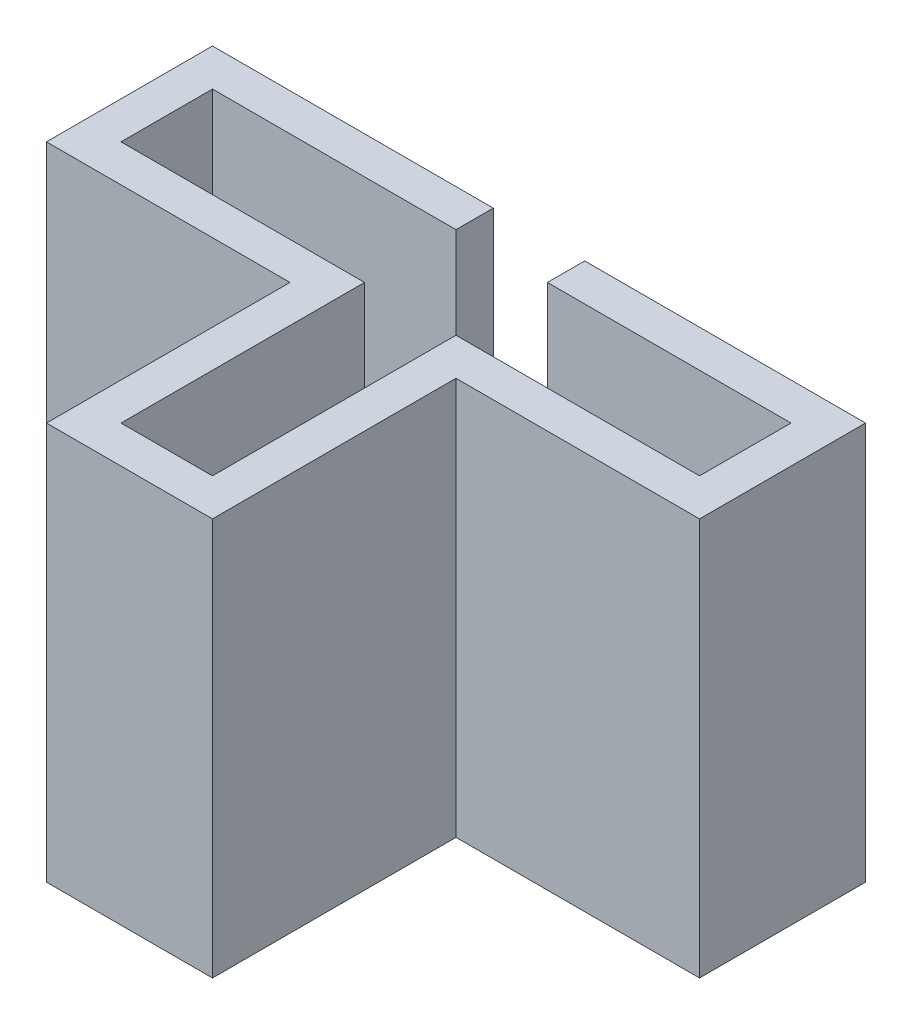
ISO-10303-21;
HEADER;
FILE_DESCRIPTION(('STEP AP214'),'2;1');
FILE_NAME('part.step','',(''),(''),'','','');
FILE_SCHEMA(('AUTOMOTIVE_DESIGN { 1 0 10303 214 1 1 1 1 }'));
ENDSEC;
DATA;
#1=APPLICATION_CONTEXT('core data for automotive mechanical design processes');
#2=APPLICATION_PROTOCOL_DEFINITION('international standard','automotive_design',2000,#1);
#3=PRODUCT_CONTEXT('',#1,'mechanical');
#4=PRODUCT('Part','Part','',(#3));
#5=PRODUCT_RELATED_PRODUCT_CATEGORY('part','',(#4));
#6=PRODUCT_DEFINITION_FORMATION('','',#4);
#7=PRODUCT_DEFINITION_CONTEXT('part definition',#1,'design');
#8=PRODUCT_DEFINITION('design','',#6,#7);
#9=PRODUCT_DEFINITION_SHAPE('','',#8);
#10=(LENGTH_UNIT() NAMED_UNIT(*) SI_UNIT(.MILLI.,.METRE.));
#11=(NAMED_UNIT(*) PLANE_ANGLE_UNIT() SI_UNIT($,.RADIAN.));
#12=(NAMED_UNIT(*) SI_UNIT($,.STERADIAN.) SOLID_ANGLE_UNIT());
#13=UNCERTAINTY_MEASURE_WITH_UNIT(LENGTH_MEASURE(1.E-05),#10,'distance_accuracy_value','');
#14=(GEOMETRIC_REPRESENTATION_CONTEXT(3) GLOBAL_UNCERTAINTY_ASSIGNED_CONTEXT((#13)) GLOBAL_UNIT_ASSIGNED_CONTEXT((#10,
#11,#12)) REPRESENTATION_CONTEXT('',''));
#15=CARTESIAN_POINT('',(0.,0.,0.));
#16=DIRECTION('',(0.,0.,1.));
#17=DIRECTION('',(1.,0.,0.));
#18=AXIS2_PLACEMENT_3D('',#15,#16,#17);
#19=CARTESIAN_POINT('',(-5.84200000000001,50.8,0.));
#20=DIRECTION('',(1.,0.,0.));
#21=DIRECTION('',(0.,0.,-1.));
#22=AXIS2_PLACEMENT_3D('',#19,#20,#21);
#23=PLANE('',#22);
#24=DIRECTION('',(0.,0.,1.));
#25=VECTOR('',#24,1.);
#26=CARTESIAN_POINT('',(-5.84200000000001,0.,0.));
#27=LINE('',#26,#25);
#28=CARTESIAN_POINT('',(-5.84200000000001,0.,-10.6045));
#29=VERTEX_POINT('',#28);
#30=CARTESIAN_POINT('',(-5.84200000000001,0.,-5.842));
#31=VERTEX_POINT('',#30);
#32=EDGE_CURVE('E262',#29,#31,#27,.T.);
#33=ORIENTED_EDGE('',*,*,#32,.F.);
#34=DIRECTION('',(0.,-1.,0.));
#35=VECTOR('',#34,1.);
#36=CARTESIAN_POINT('',(-5.84200000000001,50.8,-10.6045));
#37=LINE('',#36,#35);
#38=CARTESIAN_POINT('',(-5.84200000000001,50.8,-10.6045));
#39=VERTEX_POINT('',#38);
#40=EDGE_CURVE('E359',#39,#29,#37,.T.);
#41=ORIENTED_EDGE('',*,*,#40,.F.);
#42=DIRECTION('',(0.,0.,1.));
#43=VECTOR('',#42,1.);
#44=CARTESIAN_POINT('',(-5.84200000000001,50.8,0.));
#45=LINE('',#44,#43);
#46=CARTESIAN_POINT('',(-5.84200000000001,50.8,-5.842));
#47=VERTEX_POINT('',#46);
#48=EDGE_CURVE('E274',#39,#47,#45,.T.);
#49=ORIENTED_EDGE('',*,*,#48,.T.);
#50=DIRECTION('',(0.,-1.,0.));
#51=VECTOR('',#50,1.);
#52=CARTESIAN_POINT('',(-5.84200000000001,50.8,-5.842));
#53=LINE('',#52,#51);
#54=EDGE_CURVE('E165',#47,#31,#53,.T.);
#55=ORIENTED_EDGE('',*,*,#54,.T.);
#56=EDGE_LOOP('',(#33,#41,#49,#55));
#57=FACE_BOUND('',#56,.T.);
#58=ADVANCED_FACE('F161',(#57),#23,.T.);
#59=CARTESIAN_POINT('',(0.,0.,0.));
#60=DIRECTION('',(0.,1.,0.));
#61=DIRECTION('',(0.,0.,1.));
#62=AXIS2_PLACEMENT_3D('',#59,#60,#61);
#63=PLANE('',#62);
#64=ORIENTED_EDGE('',*,*,#32,.T.);
#65=DIRECTION('',(-1.,0.,0.));
#66=VECTOR('',#65,1.);
#67=CARTESIAN_POINT('',(0.,0.,-5.842));
#68=LINE('',#67,#66);
#69=CARTESIAN_POINT('',(-36.957,0.,-5.84199999999999));
#70=VERTEX_POINT('',#69);
#71=EDGE_CURVE('E253',#31,#70,#68,.T.);
#72=ORIENTED_EDGE('',*,*,#71,.T.);
#73=DIRECTION('',(0.,0.,1.));
#74=VECTOR('',#73,1.);
#75=CARTESIAN_POINT('',(-36.957,0.,0.));
#76=LINE('',#75,#74);
#77=CARTESIAN_POINT('',(-36.957,0.,5.842));
#78=VERTEX_POINT('',#77);
#79=EDGE_CURVE('E263',#70,#78,#76,.T.);
#80=ORIENTED_EDGE('',*,*,#79,.T.);
#81=DIRECTION('',(1.,0.,0.));
#82=VECTOR('',#81,1.);
#83=CARTESIAN_POINT('',(0.,0.,5.842));
#84=LINE('',#83,#82);
#85=CARTESIAN_POINT('',(-5.842,0.,5.842));
#86=VERTEX_POINT('',#85);
#87=EDGE_CURVE('E277',#78,#86,#84,.T.);
#88=ORIENTED_EDGE('',*,*,#87,.T.);
#89=DIRECTION('',(0.,0.,1.));
#90=VECTOR('',#89,1.);
#91=CARTESIAN_POINT('',(-5.842,0.,0.));
#92=LINE('',#91,#90);
#93=CARTESIAN_POINT('',(-5.842,0.,36.957));
#94=VERTEX_POINT('',#93);
#95=EDGE_CURVE('E275',#86,#94,#92,.T.);
#96=ORIENTED_EDGE('',*,*,#95,.T.);
#97=DIRECTION('',(1.,0.,0.));
#98=VECTOR('',#97,1.);
#99=CARTESIAN_POINT('',(0.,0.,36.957));
#100=LINE('',#99,#98);
#101=CARTESIAN_POINT('',(5.842,0.,36.957));
#102=VERTEX_POINT('',#101);
#103=EDGE_CURVE('E327',#94,#102,#100,.T.);
#104=ORIENTED_EDGE('',*,*,#103,.T.);
#105=DIRECTION('',(0.,0.,-1.));
#106=VECTOR('',#105,1.);
#107=CARTESIAN_POINT('',(5.842,0.,0.));
#108=LINE('',#107,#106);
#109=CARTESIAN_POINT('',(5.842,0.,5.842));
#110=VERTEX_POINT('',#109);
#111=EDGE_CURVE('E324',#102,#110,#108,.T.);
#112=ORIENTED_EDGE('',*,*,#111,.T.);
#113=DIRECTION('',(1.,0.,0.));
#114=VECTOR('',#113,1.);
#115=CARTESIAN_POINT('',(0.,0.,5.842));
#116=LINE('',#115,#114);
#117=CARTESIAN_POINT('',(36.957,0.,5.842));
#118=VERTEX_POINT('',#117);
#119=EDGE_CURVE('E321',#110,#118,#116,.T.);
#120=ORIENTED_EDGE('',*,*,#119,.T.);
#121=DIRECTION('',(0.,0.,-1.));
#122=VECTOR('',#121,1.);
#123=CARTESIAN_POINT('',(36.957,0.,0.));
#124=LINE('',#123,#122);
#125=CARTESIAN_POINT('',(36.957,0.,-5.842));
#126=VERTEX_POINT('',#125);
#127=EDGE_CURVE('E318',#118,#126,#124,.T.);
#128=ORIENTED_EDGE('',*,*,#127,.T.);
#129=DIRECTION('',(-1.,0.,0.));
#130=VECTOR('',#129,1.);
#131=CARTESIAN_POINT('',(0.,0.,-5.84199999999999));
#132=LINE('',#131,#130);
#133=CARTESIAN_POINT('',(5.842,0.,-5.84199999999999));
#134=VERTEX_POINT('',#133);
#135=EDGE_CURVE('E315',#126,#134,#132,.T.);
#136=ORIENTED_EDGE('',*,*,#135,.T.);
#137=DIRECTION('',(0.,0.,-1.));
#138=VECTOR('',#137,1.);
#139=CARTESIAN_POINT('',(5.842,0.,0.));
#140=LINE('',#139,#138);
#141=CARTESIAN_POINT('',(5.842,0.,-10.6045));
#142=VERTEX_POINT('',#141);
#143=EDGE_CURVE('E312',#134,#142,#140,.T.);
#144=ORIENTED_EDGE('',*,*,#143,.T.);
#145=DIRECTION('',(1.,0.,0.));
#146=VECTOR('',#145,1.);
#147=CARTESIAN_POINT('',(0.,0.,-10.6045));
#148=LINE('',#147,#146);
#149=CARTESIAN_POINT('',(41.7195,0.,-10.6045));
#150=VERTEX_POINT('',#149);
#151=EDGE_CURVE('E309',#142,#150,#148,.T.);
#152=ORIENTED_EDGE('',*,*,#151,.T.);
#153=DIRECTION('',(0.,0.,1.));
#154=VECTOR('',#153,1.);
#155=CARTESIAN_POINT('',(41.7195,0.,0.));
#156=LINE('',#155,#154);
#157=CARTESIAN_POINT('',(41.7195,0.,10.6045));
#158=VERTEX_POINT('',#157);
#159=EDGE_CURVE('E306',#150,#158,#156,.T.);
#160=ORIENTED_EDGE('',*,*,#159,.T.);
#161=DIRECTION('',(-1.,0.,0.));
#162=VECTOR('',#161,1.);
#163=CARTESIAN_POINT('',(0.,0.,10.6045));
#164=LINE('',#163,#162);
#165=CARTESIAN_POINT('',(10.6045,0.,10.6045));
#166=VERTEX_POINT('',#165);
#167=EDGE_CURVE('E303',#158,#166,#164,.T.);
#168=ORIENTED_EDGE('',*,*,#167,.T.);
#169=DIRECTION('',(0.,0.,1.));
#170=VECTOR('',#169,1.);
#171=CARTESIAN_POINT('',(10.6045,0.,0.));
#172=LINE('',#171,#170);
#173=CARTESIAN_POINT('',(10.6045,0.,41.7195));
#174=VERTEX_POINT('',#173);
#175=EDGE_CURVE('E300',#166,#174,#172,.T.);
#176=ORIENTED_EDGE('',*,*,#175,.T.);
#177=DIRECTION('',(-1.,0.,0.));
#178=VECTOR('',#177,1.);
#179=CARTESIAN_POINT('',(0.,0.,41.7195));
#180=LINE('',#179,#178);
#181=CARTESIAN_POINT('',(-10.6045,0.,41.7195));
#182=VERTEX_POINT('',#181);
#183=EDGE_CURVE('E297',#174,#182,#180,.T.);
#184=ORIENTED_EDGE('',*,*,#183,.T.);
#185=DIRECTION('',(0.,0.,-1.));
#186=VECTOR('',#185,1.);
#187=CARTESIAN_POINT('',(-10.6045,0.,0.));
#188=LINE('',#187,#186);
#189=CARTESIAN_POINT('',(-10.6045,0.,10.6045));
#190=VERTEX_POINT('',#189);
#191=EDGE_CURVE('E294',#182,#190,#188,.T.);
#192=ORIENTED_EDGE('',*,*,#191,.T.);
#193=DIRECTION('',(-1.,0.,0.));
#194=VECTOR('',#193,1.);
#195=CARTESIAN_POINT('',(0.,0.,10.6045));
#196=LINE('',#195,#194);
#197=CARTESIAN_POINT('',(-41.7195,0.,10.6045));
#198=VERTEX_POINT('',#197);
#199=EDGE_CURVE('E291',#190,#198,#196,.T.);
#200=ORIENTED_EDGE('',*,*,#199,.T.);
#201=DIRECTION('',(0.,0.,-1.));
#202=VECTOR('',#201,1.);
#203=CARTESIAN_POINT('',(-41.7195,0.,0.));
#204=LINE('',#203,#202);
#205=CARTESIAN_POINT('',(-41.7195,0.,-10.6045));
#206=VERTEX_POINT('',#205);
#207=EDGE_CURVE('E289',#198,#206,#204,.T.);
#208=ORIENTED_EDGE('',*,*,#207,.T.);
#209=DIRECTION('',(1.,0.,0.));
#210=VECTOR('',#209,1.);
#211=CARTESIAN_POINT('',(0.,0.,-10.6045));
#212=LINE('',#211,#210);
#213=EDGE_CURVE('E270',#206,#29,#212,.T.);
#214=ORIENTED_EDGE('',*,*,#213,.T.);
#215=EDGE_LOOP('',(#64,#72,#80,#88,#96,#104,#112,#120,#128,#136,#144,#152,#160,#168,#176,#184,
#192,#200,#208,#214));
#216=FACE_BOUND('',#215,.T.);
#217=ADVANCED_FACE('F267',(#216),#63,.F.);
#218=CARTESIAN_POINT('',(0.,50.8,-5.842));
#219=DIRECTION('',(0.,0.,1.));
#220=DIRECTION('',(1.,0.,0.));
#221=AXIS2_PLACEMENT_3D('',#218,#219,#220);
#222=PLANE('',#221);
#223=ORIENTED_EDGE('',*,*,#71,.F.);
#224=ORIENTED_EDGE('',*,*,#54,.F.);
#225=DIRECTION('',(-1.,0.,0.));
#226=VECTOR('',#225,1.);
#227=CARTESIAN_POINT('',(0.,50.8,-5.842));
#228=LINE('',#227,#226);
#229=CARTESIAN_POINT('',(-36.957,50.8,-5.84199999999999));
#230=VERTEX_POINT('',#229);
#231=EDGE_CURVE('E247',#47,#230,#228,.T.);
#232=ORIENTED_EDGE('',*,*,#231,.T.);
#233=DIRECTION('',(0.,-1.,0.));
#234=VECTOR('',#233,1.);
#235=CARTESIAN_POINT('',(-36.957,50.8,-5.84199999999999));
#236=LINE('',#235,#234);
#237=EDGE_CURVE('E258',#230,#70,#236,.T.);
#238=ORIENTED_EDGE('',*,*,#237,.T.);
#239=EDGE_LOOP('',(#223,#224,#232,#238));
#240=FACE_BOUND('',#239,.T.);
#241=ADVANCED_FACE('F255',(#240),#222,.T.);
#242=CARTESIAN_POINT('',(-36.957,50.8,0.));
#243=DIRECTION('',(1.,0.,0.));
#244=DIRECTION('',(0.,0.,-1.));
#245=AXIS2_PLACEMENT_3D('',#242,#243,#244);
#246=PLANE('',#245);
#247=ORIENTED_EDGE('',*,*,#79,.F.);
#248=ORIENTED_EDGE('',*,*,#237,.F.);
#249=DIRECTION('',(0.,0.,1.));
#250=VECTOR('',#249,1.);
#251=CARTESIAN_POINT('',(-36.957,50.8,0.));
#252=LINE('',#251,#250);
#253=CARTESIAN_POINT('',(-36.957,50.8,5.842));
#254=VERTEX_POINT('',#253);
#255=EDGE_CURVE('E368',#230,#254,#252,.T.);
#256=ORIENTED_EDGE('',*,*,#255,.T.);
#257=DIRECTION('',(0.,-1.,0.));
#258=VECTOR('',#257,1.);
#259=CARTESIAN_POINT('',(-36.957,50.8,5.842));
#260=LINE('',#259,#258);
#261=EDGE_CURVE('E171',#254,#78,#260,.T.);
#262=ORIENTED_EDGE('',*,*,#261,.T.);
#263=EDGE_LOOP('',(#247,#248,#256,#262));
#264=FACE_BOUND('',#263,.T.);
#265=ADVANCED_FACE('F366',(#264),#246,.T.);
#266=CARTESIAN_POINT('',(0.,50.8,5.842));
#267=DIRECTION('',(0.,0.,-1.));
#268=DIRECTION('',(-1.,0.,0.));
#269=AXIS2_PLACEMENT_3D('',#266,#267,#268);
#270=PLANE('',#269);
#271=ORIENTED_EDGE('',*,*,#87,.F.);
#272=ORIENTED_EDGE('',*,*,#261,.F.);
#273=DIRECTION('',(1.,0.,0.));
#274=VECTOR('',#273,1.);
#275=CARTESIAN_POINT('',(0.,50.8,5.842));
#276=LINE('',#275,#274);
#277=CARTESIAN_POINT('',(-5.842,50.8,5.842));
#278=VERTEX_POINT('',#277);
#279=EDGE_CURVE('E374',#254,#278,#276,.T.);
#280=ORIENTED_EDGE('',*,*,#279,.T.);
#281=DIRECTION('',(0.,-1.,0.));
#282=VECTOR('',#281,1.);
#283=CARTESIAN_POINT('',(-5.842,50.8,5.842));
#284=LINE('',#283,#282);
#285=EDGE_CURVE('E12',#278,#86,#284,.T.);
#286=ORIENTED_EDGE('',*,*,#285,.T.);
#287=EDGE_LOOP('',(#271,#272,#280,#286));
#288=FACE_BOUND('',#287,.T.);
#289=ADVANCED_FACE('F372',(#288),#270,.T.);
#290=CARTESIAN_POINT('',(-5.842,50.8,0.));
#291=DIRECTION('',(1.,0.,0.));
#292=DIRECTION('',(0.,0.,-1.));
#293=AXIS2_PLACEMENT_3D('',#290,#291,#292);
#294=PLANE('',#293);
#295=ORIENTED_EDGE('',*,*,#95,.F.);
#296=ORIENTED_EDGE('',*,*,#285,.F.);
#297=DIRECTION('',(0.,0.,1.));
#298=VECTOR('',#297,1.);
#299=CARTESIAN_POINT('',(-5.842,50.8,0.));
#300=LINE('',#299,#298);
#301=CARTESIAN_POINT('',(-5.842,50.8,36.957));
#302=VERTEX_POINT('',#301);
#303=EDGE_CURVE('E329',#278,#302,#300,.T.);
#304=ORIENTED_EDGE('',*,*,#303,.T.);
#305=DIRECTION('',(0.,-1.,0.));
#306=VECTOR('',#305,1.);
#307=CARTESIAN_POINT('',(-5.842,50.8,36.957));
#308=LINE('',#307,#306);
#309=EDGE_CURVE('E179',#302,#94,#308,.T.);
#310=ORIENTED_EDGE('',*,*,#309,.T.);
#311=EDGE_LOOP('',(#295,#296,#304,#310));
#312=FACE_BOUND('',#311,.T.);
#313=ADVANCED_FACE('F163',(#312),#294,.T.);
#314=CARTESIAN_POINT('',(0.,50.8,36.957));
#315=DIRECTION('',(0.,0.,-1.));
#316=DIRECTION('',(-1.,0.,0.));
#317=AXIS2_PLACEMENT_3D('',#314,#315,#316);
#318=PLANE('',#317);
#319=ORIENTED_EDGE('',*,*,#103,.F.);
#320=ORIENTED_EDGE('',*,*,#309,.F.);
#321=DIRECTION('',(1.,0.,0.));
#322=VECTOR('',#321,1.);
#323=CARTESIAN_POINT('',(0.,50.8,36.957));
#324=LINE('',#323,#322);
#325=CARTESIAN_POINT('',(5.842,50.8,36.957));
#326=VERTEX_POINT('',#325);
#327=EDGE_CURVE('E284',#302,#326,#324,.T.);
#328=ORIENTED_EDGE('',*,*,#327,.T.);
#329=DIRECTION('',(0.,-1.,0.));
#330=VECTOR('',#329,1.);
#331=CARTESIAN_POINT('',(5.842,50.8,36.957));
#332=LINE('',#331,#330);
#333=EDGE_CURVE('E331',#326,#102,#332,.T.);
#334=ORIENTED_EDGE('',*,*,#333,.T.);
#335=EDGE_LOOP('',(#319,#320,#328,#334));
#336=FACE_BOUND('',#335,.T.);
#337=ADVANCED_FACE('F483',(#336),#318,.T.);
#338=CARTESIAN_POINT('',(5.842,50.8,0.));
#339=DIRECTION('',(-1.,0.,0.));
#340=DIRECTION('',(0.,0.,1.));
#341=AXIS2_PLACEMENT_3D('',#338,#339,#340);
#342=PLANE('',#341);
#343=ORIENTED_EDGE('',*,*,#111,.F.);
#344=ORIENTED_EDGE('',*,*,#333,.F.);
#345=DIRECTION('',(0.,0.,-1.));
#346=VECTOR('',#345,1.);
#347=CARTESIAN_POINT('',(5.842,50.8,0.));
#348=LINE('',#347,#346);
#349=CARTESIAN_POINT('',(5.842,50.8,5.842));
#350=VERTEX_POINT('',#349);
#351=EDGE_CURVE('E383',#326,#350,#348,.T.);
#352=ORIENTED_EDGE('',*,*,#351,.T.);
#353=DIRECTION('',(0.,-1.,0.));
#354=VECTOR('',#353,1.);
#355=CARTESIAN_POINT('',(5.842,50.8,5.842));
#356=LINE('',#355,#354);
#357=EDGE_CURVE('E333',#350,#110,#356,.T.);
#358=ORIENTED_EDGE('',*,*,#357,.T.);
#359=EDGE_LOOP('',(#343,#344,#352,#358));
#360=FACE_BOUND('',#359,.T.);
#361=ADVANCED_FACE('F482',(#360),#342,.T.);
#362=CARTESIAN_POINT('',(0.,50.8,5.842));
#363=DIRECTION('',(0.,0.,-1.));
#364=DIRECTION('',(-1.,0.,0.));
#365=AXIS2_PLACEMENT_3D('',#362,#363,#364);
#366=PLANE('',#365);
#367=ORIENTED_EDGE('',*,*,#119,.F.);
#368=ORIENTED_EDGE('',*,*,#357,.F.);
#369=DIRECTION('',(1.,0.,0.));
#370=VECTOR('',#369,1.);
#371=CARTESIAN_POINT('',(0.,50.8,5.842));
#372=LINE('',#371,#370);
#373=CARTESIAN_POINT('',(36.957,50.8,5.842));
#374=VERTEX_POINT('',#373);
#375=EDGE_CURVE('E384',#350,#374,#372,.T.);
#376=ORIENTED_EDGE('',*,*,#375,.T.);
#377=DIRECTION('',(0.,-1.,0.));
#378=VECTOR('',#377,1.);
#379=CARTESIAN_POINT('',(36.957,50.8,5.842));
#380=LINE('',#379,#378);
#381=EDGE_CURVE('E335',#374,#118,#380,.T.);
#382=ORIENTED_EDGE('',*,*,#381,.T.);
#383=EDGE_LOOP('',(#367,#368,#376,#382));
#384=FACE_BOUND('',#383,.T.);
#385=ADVANCED_FACE('F473',(#384),#366,.T.);
#386=CARTESIAN_POINT('',(36.957,50.8,0.));
#387=DIRECTION('',(-1.,0.,0.));
#388=DIRECTION('',(0.,0.,1.));
#389=AXIS2_PLACEMENT_3D('',#386,#387,#388);
#390=PLANE('',#389);
#391=ORIENTED_EDGE('',*,*,#127,.F.);
#392=ORIENTED_EDGE('',*,*,#381,.F.);
#393=DIRECTION('',(0.,0.,-1.));
#394=VECTOR('',#393,1.);
#395=CARTESIAN_POINT('',(36.957,50.8,0.));
#396=LINE('',#395,#394);
#397=CARTESIAN_POINT('',(36.957,50.8,-5.842));
#398=VERTEX_POINT('',#397);
#399=EDGE_CURVE('E387',#374,#398,#396,.T.);
#400=ORIENTED_EDGE('',*,*,#399,.T.);
#401=DIRECTION('',(0.,-1.,0.));
#402=VECTOR('',#401,1.);
#403=CARTESIAN_POINT('',(36.957,50.8,-5.842));
#404=LINE('',#403,#402);
#405=EDGE_CURVE('E337',#398,#126,#404,.T.);
#406=ORIENTED_EDGE('',*,*,#405,.T.);
#407=EDGE_LOOP('',(#391,#392,#400,#406));
#408=FACE_BOUND('',#407,.T.);
#409=ADVANCED_FACE('F480',(#408),#390,.T.);
#410=CARTESIAN_POINT('',(0.,50.8,-5.84199999999999));
#411=DIRECTION('',(0.,0.,1.));
#412=DIRECTION('',(1.,0.,0.));
#413=AXIS2_PLACEMENT_3D('',#410,#411,#412);
#414=PLANE('',#413);
#415=ORIENTED_EDGE('',*,*,#135,.F.);
#416=ORIENTED_EDGE('',*,*,#405,.F.);
#417=DIRECTION('',(-1.,0.,0.));
#418=VECTOR('',#417,1.);
#419=CARTESIAN_POINT('',(0.,50.8,-5.84199999999999));
#420=LINE('',#419,#418);
#421=CARTESIAN_POINT('',(5.842,50.8,-5.84199999999999));
#422=VERTEX_POINT('',#421);
#423=EDGE_CURVE('E392',#398,#422,#420,.T.);
#424=ORIENTED_EDGE('',*,*,#423,.T.);
#425=DIRECTION('',(0.,-1.,0.));
#426=VECTOR('',#425,1.);
#427=CARTESIAN_POINT('',(5.842,50.8,-5.84199999999999));
#428=LINE('',#427,#426);
#429=EDGE_CURVE('E339',#422,#134,#428,.T.);
#430=ORIENTED_EDGE('',*,*,#429,.T.);
#431=EDGE_LOOP('',(#415,#416,#424,#430));
#432=FACE_BOUND('',#431,.T.);
#433=ADVANCED_FACE('F558',(#432),#414,.T.);
#434=CARTESIAN_POINT('',(5.842,50.8,0.));
#435=DIRECTION('',(-1.,0.,0.));
#436=DIRECTION('',(0.,0.,1.));
#437=AXIS2_PLACEMENT_3D('',#434,#435,#436);
#438=PLANE('',#437);
#439=ORIENTED_EDGE('',*,*,#143,.F.);
#440=ORIENTED_EDGE('',*,*,#429,.F.);
#441=DIRECTION('',(0.,0.,-1.));
#442=VECTOR('',#441,1.);
#443=CARTESIAN_POINT('',(5.842,50.8,0.));
#444=LINE('',#443,#442);
#445=CARTESIAN_POINT('',(5.842,50.8,-10.6045));
#446=VERTEX_POINT('',#445);
#447=EDGE_CURVE('E395',#422,#446,#444,.T.);
#448=ORIENTED_EDGE('',*,*,#447,.T.);
#449=DIRECTION('',(0.,-1.,0.));
#450=VECTOR('',#449,1.);
#451=CARTESIAN_POINT('',(5.842,50.8,-10.6045));
#452=LINE('',#451,#450);
#453=EDGE_CURVE('E341',#446,#142,#452,.T.);
#454=ORIENTED_EDGE('',*,*,#453,.T.);
#455=EDGE_LOOP('',(#439,#440,#448,#454));
#456=FACE_BOUND('',#455,.T.);
#457=ADVANCED_FACE('F568',(#456),#438,.T.);
#458=CARTESIAN_POINT('',(0.,50.8,-10.6045));
#459=DIRECTION('',(0.,0.,-1.));
#460=DIRECTION('',(-1.,0.,0.));
#461=AXIS2_PLACEMENT_3D('',#458,#459,#460);
#462=PLANE('',#461);
#463=ORIENTED_EDGE('',*,*,#151,.F.);
#464=ORIENTED_EDGE('',*,*,#453,.F.);
#465=DIRECTION('',(1.,0.,0.));
#466=VECTOR('',#465,1.);
#467=CARTESIAN_POINT('',(0.,50.8,-10.6045));
#468=LINE('',#467,#466);
#469=CARTESIAN_POINT('',(41.7195,50.8,-10.6045));
#470=VERTEX_POINT('',#469);
#471=EDGE_CURVE('E398',#446,#470,#468,.T.);
#472=ORIENTED_EDGE('',*,*,#471,.T.);
#473=DIRECTION('',(0.,-1.,0.));
#474=VECTOR('',#473,1.);
#475=CARTESIAN_POINT('',(41.7195,50.8,-10.6045));
#476=LINE('',#475,#474);
#477=EDGE_CURVE('E343',#470,#150,#476,.T.);
#478=ORIENTED_EDGE('',*,*,#477,.T.);
#479=EDGE_LOOP('',(#463,#464,#472,#478));
#480=FACE_BOUND('',#479,.T.);
#481=ADVANCED_FACE('F579',(#480),#462,.T.);
#482=CARTESIAN_POINT('',(41.7195,50.8,0.));
#483=DIRECTION('',(1.,0.,0.));
#484=DIRECTION('',(0.,0.,-1.));
#485=AXIS2_PLACEMENT_3D('',#482,#483,#484);
#486=PLANE('',#485);
#487=ORIENTED_EDGE('',*,*,#159,.F.);
#488=ORIENTED_EDGE('',*,*,#477,.F.);
#489=DIRECTION('',(0.,0.,1.));
#490=VECTOR('',#489,1.);
#491=CARTESIAN_POINT('',(41.7195,50.8,0.));
#492=LINE('',#491,#490);
#493=CARTESIAN_POINT('',(41.7195,50.8,10.6045));
#494=VERTEX_POINT('',#493);
#495=EDGE_CURVE('E401',#470,#494,#492,.T.);
#496=ORIENTED_EDGE('',*,*,#495,.T.);
#497=DIRECTION('',(0.,-1.,0.));
#498=VECTOR('',#497,1.);
#499=CARTESIAN_POINT('',(41.7195,50.8,10.6045));
#500=LINE('',#499,#498);
#501=EDGE_CURVE('E345',#494,#158,#500,.T.);
#502=ORIENTED_EDGE('',*,*,#501,.T.);
#503=EDGE_LOOP('',(#487,#488,#496,#502));
#504=FACE_BOUND('',#503,.T.);
#505=ADVANCED_FACE('F590',(#504),#486,.T.);
#506=CARTESIAN_POINT('',(0.,50.8,10.6045));
#507=DIRECTION('',(0.,0.,1.));
#508=DIRECTION('',(1.,0.,0.));
#509=AXIS2_PLACEMENT_3D('',#506,#507,#508);
#510=PLANE('',#509);
#511=ORIENTED_EDGE('',*,*,#167,.F.);
#512=ORIENTED_EDGE('',*,*,#501,.F.);
#513=DIRECTION('',(-1.,0.,0.));
#514=VECTOR('',#513,1.);
#515=CARTESIAN_POINT('',(0.,50.8,10.6045));
#516=LINE('',#515,#514);
#517=CARTESIAN_POINT('',(10.6045,50.8,10.6045));
#518=VERTEX_POINT('',#517);
#519=EDGE_CURVE('E404',#494,#518,#516,.T.);
#520=ORIENTED_EDGE('',*,*,#519,.T.);
#521=DIRECTION('',(0.,-1.,0.));
#522=VECTOR('',#521,1.);
#523=CARTESIAN_POINT('',(10.6045,50.8,10.6045));
#524=LINE('',#523,#522);
#525=EDGE_CURVE('E347',#518,#166,#524,.T.);
#526=ORIENTED_EDGE('',*,*,#525,.T.);
#527=EDGE_LOOP('',(#511,#512,#520,#526));
#528=FACE_BOUND('',#527,.T.);
#529=ADVANCED_FACE('F601',(#528),#510,.T.);
#530=CARTESIAN_POINT('',(10.6045,50.8,0.));
#531=DIRECTION('',(1.,0.,0.));
#532=DIRECTION('',(0.,0.,-1.));
#533=AXIS2_PLACEMENT_3D('',#530,#531,#532);
#534=PLANE('',#533);
#535=ORIENTED_EDGE('',*,*,#175,.F.);
#536=ORIENTED_EDGE('',*,*,#525,.F.);
#537=DIRECTION('',(0.,0.,1.));
#538=VECTOR('',#537,1.);
#539=CARTESIAN_POINT('',(10.6045,50.8,0.));
#540=LINE('',#539,#538);
#541=CARTESIAN_POINT('',(10.6045,50.8,41.7195));
#542=VERTEX_POINT('',#541);
#543=EDGE_CURVE('E407',#518,#542,#540,.T.);
#544=ORIENTED_EDGE('',*,*,#543,.T.);
#545=DIRECTION('',(0.,-1.,0.));
#546=VECTOR('',#545,1.);
#547=CARTESIAN_POINT('',(10.6045,50.8,41.7195));
#548=LINE('',#547,#546);
#549=EDGE_CURVE('E349',#542,#174,#548,.T.);
#550=ORIENTED_EDGE('',*,*,#549,.T.);
#551=EDGE_LOOP('',(#535,#536,#544,#550));
#552=FACE_BOUND('',#551,.T.);
#553=ADVANCED_FACE('F612',(#552),#534,.T.);
#554=CARTESIAN_POINT('',(0.,50.8,41.7195));
#555=DIRECTION('',(0.,0.,1.));
#556=DIRECTION('',(1.,0.,0.));
#557=AXIS2_PLACEMENT_3D('',#554,#555,#556);
#558=PLANE('',#557);
#559=ORIENTED_EDGE('',*,*,#183,.F.);
#560=ORIENTED_EDGE('',*,*,#549,.F.);
#561=DIRECTION('',(-1.,0.,0.));
#562=VECTOR('',#561,1.);
#563=CARTESIAN_POINT('',(0.,50.8,41.7195));
#564=LINE('',#563,#562);
#565=CARTESIAN_POINT('',(-10.6045,50.8,41.7195));
#566=VERTEX_POINT('',#565);
#567=EDGE_CURVE('E410',#542,#566,#564,.T.);
#568=ORIENTED_EDGE('',*,*,#567,.T.);
#569=DIRECTION('',(0.,-1.,0.));
#570=VECTOR('',#569,1.);
#571=CARTESIAN_POINT('',(-10.6045,50.8,41.7195));
#572=LINE('',#571,#570);
#573=EDGE_CURVE('E351',#566,#182,#572,.T.);
#574=ORIENTED_EDGE('',*,*,#573,.T.);
#575=EDGE_LOOP('',(#559,#560,#568,#574));
#576=FACE_BOUND('',#575,.T.);
#577=ADVANCED_FACE('F623',(#576),#558,.T.);
#578=CARTESIAN_POINT('',(-10.6045,50.8,0.));
#579=DIRECTION('',(-1.,0.,0.));
#580=DIRECTION('',(0.,0.,1.));
#581=AXIS2_PLACEMENT_3D('',#578,#579,#580);
#582=PLANE('',#581);
#583=ORIENTED_EDGE('',*,*,#191,.F.);
#584=ORIENTED_EDGE('',*,*,#573,.F.);
#585=DIRECTION('',(0.,0.,-1.));
#586=VECTOR('',#585,1.);
#587=CARTESIAN_POINT('',(-10.6045,50.8,0.));
#588=LINE('',#587,#586);
#589=CARTESIAN_POINT('',(-10.6045,50.8,10.6045));
#590=VERTEX_POINT('',#589);
#591=EDGE_CURVE('E413',#566,#590,#588,.T.);
#592=ORIENTED_EDGE('',*,*,#591,.T.);
#593=DIRECTION('',(0.,-1.,0.));
#594=VECTOR('',#593,1.);
#595=CARTESIAN_POINT('',(-10.6045,50.8,10.6045));
#596=LINE('',#595,#594);
#597=EDGE_CURVE('E353',#590,#190,#596,.T.);
#598=ORIENTED_EDGE('',*,*,#597,.T.);
#599=EDGE_LOOP('',(#583,#584,#592,#598));
#600=FACE_BOUND('',#599,.T.);
#601=ADVANCED_FACE('F634',(#600),#582,.T.);
#602=CARTESIAN_POINT('',(0.,50.8,10.6045));
#603=DIRECTION('',(0.,0.,1.));
#604=DIRECTION('',(1.,0.,0.));
#605=AXIS2_PLACEMENT_3D('',#602,#603,#604);
#606=PLANE('',#605);
#607=ORIENTED_EDGE('',*,*,#199,.F.);
#608=ORIENTED_EDGE('',*,*,#597,.F.);
#609=DIRECTION('',(-1.,0.,0.));
#610=VECTOR('',#609,1.);
#611=CARTESIAN_POINT('',(0.,50.8,10.6045));
#612=LINE('',#611,#610);
#613=CARTESIAN_POINT('',(-41.7195,50.8,10.6045));
#614=VERTEX_POINT('',#613);
#615=EDGE_CURVE('E416',#590,#614,#612,.T.);
#616=ORIENTED_EDGE('',*,*,#615,.T.);
#617=DIRECTION('',(0.,-1.,0.));
#618=VECTOR('',#617,1.);
#619=CARTESIAN_POINT('',(-41.7195,50.8,10.6045));
#620=LINE('',#619,#618);
#621=EDGE_CURVE('E355',#614,#198,#620,.T.);
#622=ORIENTED_EDGE('',*,*,#621,.T.);
#623=EDGE_LOOP('',(#607,#608,#616,#622));
#624=FACE_BOUND('',#623,.T.);
#625=ADVANCED_FACE('F511',(#624),#606,.T.);
#626=CARTESIAN_POINT('',(-41.7195,50.8,0.));
#627=DIRECTION('',(-1.,0.,0.));
#628=DIRECTION('',(0.,0.,1.));
#629=AXIS2_PLACEMENT_3D('',#626,#627,#628);
#630=PLANE('',#629);
#631=ORIENTED_EDGE('',*,*,#207,.F.);
#632=ORIENTED_EDGE('',*,*,#621,.F.);
#633=DIRECTION('',(0.,0.,-1.));
#634=VECTOR('',#633,1.);
#635=CARTESIAN_POINT('',(-41.7195,50.8,0.));
#636=LINE('',#635,#634);
#637=CARTESIAN_POINT('',(-41.7195,50.8,-10.6045));
#638=VERTEX_POINT('',#637);
#639=EDGE_CURVE('E419',#614,#638,#636,.T.);
#640=ORIENTED_EDGE('',*,*,#639,.T.);
#641=DIRECTION('',(0.,-1.,0.));
#642=VECTOR('',#641,1.);
#643=CARTESIAN_POINT('',(-41.7195,50.8,-10.6045));
#644=LINE('',#643,#642);
#645=EDGE_CURVE('E357',#638,#206,#644,.T.);
#646=ORIENTED_EDGE('',*,*,#645,.T.);
#647=EDGE_LOOP('',(#631,#632,#640,#646));
#648=FACE_BOUND('',#647,.T.);
#649=ADVANCED_FACE('F505',(#648),#630,.T.);
#650=CARTESIAN_POINT('',(0.,50.8,-10.6045));
#651=DIRECTION('',(0.,0.,-1.));
#652=DIRECTION('',(-1.,0.,0.));
#653=AXIS2_PLACEMENT_3D('',#650,#651,#652);
#654=PLANE('',#653);
#655=ORIENTED_EDGE('',*,*,#213,.F.);
#656=ORIENTED_EDGE('',*,*,#645,.F.);
#657=DIRECTION('',(1.,0.,0.));
#658=VECTOR('',#657,1.);
#659=CARTESIAN_POINT('',(0.,50.8,-10.6045));
#660=LINE('',#659,#658);
#661=EDGE_CURVE('E422',#638,#39,#660,.T.);
#662=ORIENTED_EDGE('',*,*,#661,.T.);
#663=ORIENTED_EDGE('',*,*,#40,.T.);
#664=EDGE_LOOP('',(#655,#656,#662,#663));
#665=FACE_BOUND('',#664,.T.);
#666=ADVANCED_FACE('F501',(#665),#654,.T.);
#667=CARTESIAN_POINT('',(0.,50.8,0.));
#668=DIRECTION('',(0.,1.,0.));
#669=DIRECTION('',(0.,0.,1.));
#670=AXIS2_PLACEMENT_3D('',#667,#668,#669);
#671=PLANE('',#670);
#672=ORIENTED_EDGE('',*,*,#231,.F.);
#673=ORIENTED_EDGE('',*,*,#48,.F.);
#674=ORIENTED_EDGE('',*,*,#661,.F.);
#675=ORIENTED_EDGE('',*,*,#639,.F.);
#676=ORIENTED_EDGE('',*,*,#615,.F.);
#677=ORIENTED_EDGE('',*,*,#591,.F.);
#678=ORIENTED_EDGE('',*,*,#567,.F.);
#679=ORIENTED_EDGE('',*,*,#543,.F.);
#680=ORIENTED_EDGE('',*,*,#519,.F.);
#681=ORIENTED_EDGE('',*,*,#495,.F.);
#682=ORIENTED_EDGE('',*,*,#471,.F.);
#683=ORIENTED_EDGE('',*,*,#447,.F.);
#684=ORIENTED_EDGE('',*,*,#423,.F.);
#685=ORIENTED_EDGE('',*,*,#399,.F.);
#686=ORIENTED_EDGE('',*,*,#375,.F.);
#687=ORIENTED_EDGE('',*,*,#351,.F.);
#688=ORIENTED_EDGE('',*,*,#327,.F.);
#689=ORIENTED_EDGE('',*,*,#303,.F.);
#690=ORIENTED_EDGE('',*,*,#279,.F.);
#691=ORIENTED_EDGE('',*,*,#255,.F.);
#692=EDGE_LOOP('',(#672,#673,#674,#675,#676,#677,#678,#679,#680,#681,#682,#683,#684,#685,#686,
#687,#688,#689,#690,#691));
#693=FACE_BOUND('',#692,.T.);
#694=ADVANCED_FACE('F380',(#693),#671,.T.);
#695=CLOSED_SHELL('',(#58,#217,#241,#265,#289,#313,#337,#361,#385,#409,#433,#457,#481,#505,#529,
#553,#577,#601,#625,#649,#666,#694));
#696=MANIFOLD_SOLID_BREP('B2',#695);
#697=ADVANCED_BREP_SHAPE_REPRESENTATION('',(#18,#696),#14);
#698=SHAPE_DEFINITION_REPRESENTATION(#9,#697);
ENDSEC;
END-ISO-10303-21;
